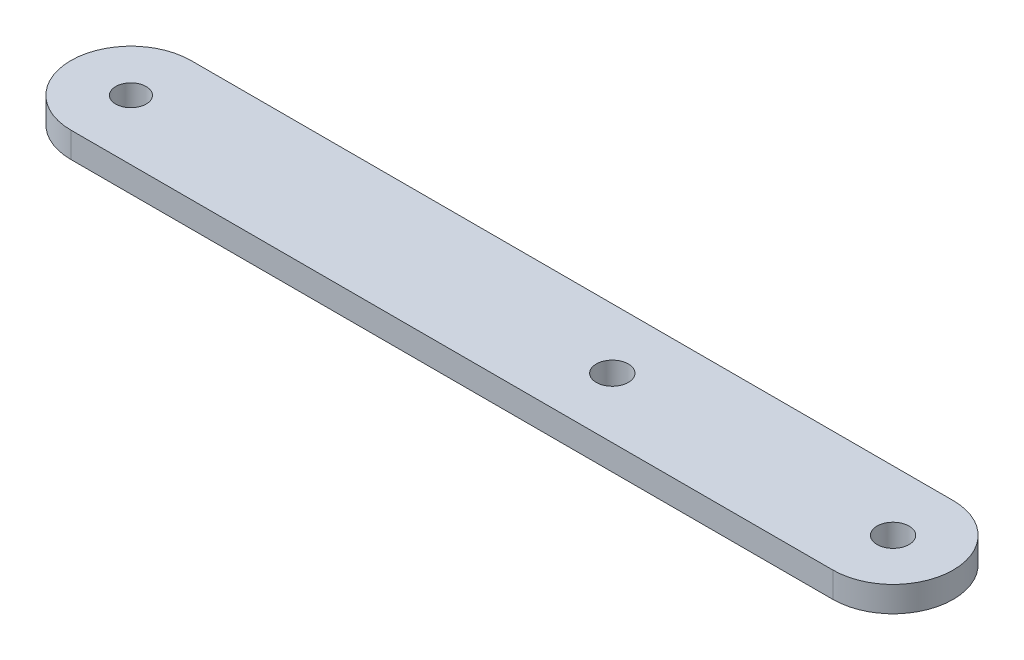
ISO-10303-21;
HEADER;
FILE_DESCRIPTION(('STEP AP214'),'2;1');
FILE_NAME('part.step','',(''),(''),'','','');
FILE_SCHEMA(('AUTOMOTIVE_DESIGN { 1 0 10303 214 1 1 1 1 }'));
ENDSEC;
DATA;
#1=APPLICATION_CONTEXT('core data for automotive mechanical design processes');
#2=APPLICATION_PROTOCOL_DEFINITION('international standard','automotive_design',2000,#1);
#3=PRODUCT_CONTEXT('',#1,'mechanical');
#4=PRODUCT('Part','Part','',(#3));
#5=PRODUCT_RELATED_PRODUCT_CATEGORY('part','',(#4));
#6=PRODUCT_DEFINITION_FORMATION('','',#4);
#7=PRODUCT_DEFINITION_CONTEXT('part definition',#1,'design');
#8=PRODUCT_DEFINITION('design','',#6,#7);
#9=PRODUCT_DEFINITION_SHAPE('','',#8);
#10=(LENGTH_UNIT() NAMED_UNIT(*) SI_UNIT(.MILLI.,.METRE.));
#11=(NAMED_UNIT(*) PLANE_ANGLE_UNIT() SI_UNIT($,.RADIAN.));
#12=(NAMED_UNIT(*) SI_UNIT($,.STERADIAN.) SOLID_ANGLE_UNIT());
#13=UNCERTAINTY_MEASURE_WITH_UNIT(LENGTH_MEASURE(1.E-05),#10,'distance_accuracy_value','');
#14=(GEOMETRIC_REPRESENTATION_CONTEXT(3) GLOBAL_UNCERTAINTY_ASSIGNED_CONTEXT((#13)) GLOBAL_UNIT_ASSIGNED_CONTEXT((#10,
#11,#12)) REPRESENTATION_CONTEXT('',''));
#15=CARTESIAN_POINT('',(0.,0.,0.));
#16=DIRECTION('',(0.,0.,1.));
#17=DIRECTION('',(1.,0.,0.));
#18=AXIS2_PLACEMENT_3D('',#15,#16,#17);
#19=CARTESIAN_POINT('',(0.,3.175,0.));
#20=DIRECTION('',(0.,1.,0.));
#21=DIRECTION('',(0.,0.,1.));
#22=AXIS2_PLACEMENT_3D('',#19,#20,#21);
#23=PLANE('',#22);
#24=CARTESIAN_POINT('',(60.,3.175,0.));
#25=DIRECTION('',(0.,1.,0.));
#26=DIRECTION('',(0.,0.,1.));
#27=AXIS2_PLACEMENT_3D('',#24,#25,#26);
#28=CIRCLE('',#27,2.);
#29=CARTESIAN_POINT('',(60.,3.175,2.));
#30=VERTEX_POINT('',#29);
#31=EDGE_CURVE('E115',#30,#30,#28,.T.);
#32=ORIENTED_EDGE('',*,*,#31,.F.);
#33=EDGE_LOOP('',(#32));
#34=FACE_BOUND('',#33,.T.);
#35=CARTESIAN_POINT('',(0.,3.175,0.));
#36=DIRECTION('',(0.,1.,0.));
#37=DIRECTION('',(0.,0.,1.));
#38=AXIS2_PLACEMENT_3D('',#35,#36,#37);
#39=CIRCLE('',#38,7.5);
#40=CARTESIAN_POINT('',(0.,3.175,-7.5));
#41=VERTEX_POINT('',#40);
#42=CARTESIAN_POINT('',(0.,3.175,7.5));
#43=VERTEX_POINT('',#42);
#44=EDGE_CURVE('E85',#41,#43,#39,.T.);
#45=ORIENTED_EDGE('',*,*,#44,.T.);
#46=DIRECTION('',(1.,0.,0.));
#47=VECTOR('',#46,1.);
#48=CARTESIAN_POINT('',(0.,3.175,7.5));
#49=LINE('',#48,#47);
#50=CARTESIAN_POINT('',(95.,3.175,7.5));
#51=VERTEX_POINT('',#50);
#52=EDGE_CURVE('E80',#43,#51,#49,.T.);
#53=ORIENTED_EDGE('',*,*,#52,.T.);
#54=CARTESIAN_POINT('',(95.,3.175,0.));
#55=DIRECTION('',(0.,1.,0.));
#56=DIRECTION('',(0.,0.,1.));
#57=AXIS2_PLACEMENT_3D('',#54,#55,#56);
#58=CIRCLE('',#57,7.5);
#59=CARTESIAN_POINT('',(95.,3.175,-7.5));
#60=VERTEX_POINT('',#59);
#61=EDGE_CURVE('E83',#51,#60,#58,.T.);
#62=ORIENTED_EDGE('',*,*,#61,.T.);
#63=DIRECTION('',(-1.,0.,0.));
#64=VECTOR('',#63,1.);
#65=CARTESIAN_POINT('',(0.,3.175,-7.5));
#66=LINE('',#65,#64);
#67=EDGE_CURVE('E50',#60,#41,#66,.T.);
#68=ORIENTED_EDGE('',*,*,#67,.T.);
#69=EDGE_LOOP('',(#45,#53,#62,#68));
#70=FACE_BOUND('',#69,.T.);
#71=CARTESIAN_POINT('',(0.,3.175,0.));
#72=DIRECTION('',(0.,1.,0.));
#73=DIRECTION('',(0.,0.,1.));
#74=AXIS2_PLACEMENT_3D('',#71,#72,#73);
#75=CIRCLE('',#74,1.9);
#76=CARTESIAN_POINT('',(0.,3.175,1.9));
#77=VERTEX_POINT('',#76);
#78=EDGE_CURVE('E100',#77,#77,#75,.T.);
#79=ORIENTED_EDGE('',*,*,#78,.F.);
#80=EDGE_LOOP('',(#79));
#81=FACE_BOUND('',#80,.T.);
#82=CARTESIAN_POINT('',(95.,3.175,0.));
#83=DIRECTION('',(0.,1.,0.));
#84=DIRECTION('',(0.,0.,1.));
#85=AXIS2_PLACEMENT_3D('',#82,#83,#84);
#86=CIRCLE('',#85,2.);
#87=CARTESIAN_POINT('',(95.,3.175,2.));
#88=VERTEX_POINT('',#87);
#89=EDGE_CURVE('E121',#88,#88,#86,.T.);
#90=ORIENTED_EDGE('',*,*,#89,.F.);
#91=EDGE_LOOP('',(#90));
#92=FACE_BOUND('',#91,.T.);
#93=ADVANCED_FACE('F33',(#34,#70,#81,#92),#23,.T.);
#94=CARTESIAN_POINT('',(0.,0.,0.));
#95=DIRECTION('',(0.,1.,0.));
#96=DIRECTION('',(0.,0.,1.));
#97=AXIS2_PLACEMENT_3D('',#94,#95,#96);
#98=PLANE('',#97);
#99=CARTESIAN_POINT('',(0.,0.,0.));
#100=DIRECTION('',(0.,1.,0.));
#101=DIRECTION('',(0.,0.,1.));
#102=AXIS2_PLACEMENT_3D('',#99,#100,#101);
#103=CIRCLE('',#102,7.5);
#104=CARTESIAN_POINT('',(0.,0.,-7.5));
#105=VERTEX_POINT('',#104);
#106=CARTESIAN_POINT('',(0.,0.,7.5));
#107=VERTEX_POINT('',#106);
#108=EDGE_CURVE('E97',#105,#107,#103,.T.);
#109=ORIENTED_EDGE('',*,*,#108,.F.);
#110=DIRECTION('',(-1.,0.,0.));
#111=VECTOR('',#110,1.);
#112=CARTESIAN_POINT('',(0.,0.,-7.5));
#113=LINE('',#112,#111);
#114=CARTESIAN_POINT('',(95.,0.,-7.5));
#115=VERTEX_POINT('',#114);
#116=EDGE_CURVE('E73',#115,#105,#113,.T.);
#117=ORIENTED_EDGE('',*,*,#116,.F.);
#118=CARTESIAN_POINT('',(95.,0.,0.));
#119=DIRECTION('',(0.,1.,0.));
#120=DIRECTION('',(0.,0.,1.));
#121=AXIS2_PLACEMENT_3D('',#118,#119,#120);
#122=CIRCLE('',#121,7.5);
#123=CARTESIAN_POINT('',(95.,0.,7.5));
#124=VERTEX_POINT('',#123);
#125=EDGE_CURVE('E67',#124,#115,#122,.T.);
#126=ORIENTED_EDGE('',*,*,#125,.F.);
#127=DIRECTION('',(1.,0.,0.));
#128=VECTOR('',#127,1.);
#129=CARTESIAN_POINT('',(0.,0.,7.5));
#130=LINE('',#129,#128);
#131=EDGE_CURVE('E89',#107,#124,#130,.T.);
#132=ORIENTED_EDGE('',*,*,#131,.F.);
#133=EDGE_LOOP('',(#109,#117,#126,#132));
#134=FACE_BOUND('',#133,.T.);
#135=CARTESIAN_POINT('',(0.,0.,0.));
#136=DIRECTION('',(0.,1.,0.));
#137=DIRECTION('',(0.,0.,1.));
#138=AXIS2_PLACEMENT_3D('',#135,#136,#137);
#139=CIRCLE('',#138,1.9);
#140=CARTESIAN_POINT('',(0.,0.,1.9));
#141=VERTEX_POINT('',#140);
#142=EDGE_CURVE('E112',#141,#141,#139,.T.);
#143=ORIENTED_EDGE('',*,*,#142,.T.);
#144=EDGE_LOOP('',(#143));
#145=FACE_BOUND('',#144,.T.);
#146=CARTESIAN_POINT('',(60.,0.,0.));
#147=DIRECTION('',(0.,1.,0.));
#148=DIRECTION('',(0.,0.,1.));
#149=AXIS2_PLACEMENT_3D('',#146,#147,#148);
#150=CIRCLE('',#149,2.);
#151=CARTESIAN_POINT('',(60.,0.,2.));
#152=VERTEX_POINT('',#151);
#153=EDGE_CURVE('E118',#152,#152,#150,.T.);
#154=ORIENTED_EDGE('',*,*,#153,.T.);
#155=EDGE_LOOP('',(#154));
#156=FACE_BOUND('',#155,.T.);
#157=CARTESIAN_POINT('',(95.,0.,0.));
#158=DIRECTION('',(0.,1.,0.));
#159=DIRECTION('',(0.,0.,1.));
#160=AXIS2_PLACEMENT_3D('',#157,#158,#159);
#161=CIRCLE('',#160,2.);
#162=CARTESIAN_POINT('',(95.,0.,2.));
#163=VERTEX_POINT('',#162);
#164=EDGE_CURVE('E124',#163,#163,#161,.T.);
#165=ORIENTED_EDGE('',*,*,#164,.T.);
#166=EDGE_LOOP('',(#165));
#167=FACE_BOUND('',#166,.T.);
#168=ADVANCED_FACE('F108',(#134,#145,#156,#167),#98,.F.);
#169=CARTESIAN_POINT('',(0.,3.175,0.));
#170=DIRECTION('',(0.,-1.,0.));
#171=DIRECTION('',(0.,0.,-1.));
#172=AXIS2_PLACEMENT_3D('',#169,#170,#171);
#173=CYLINDRICAL_SURFACE('',#172,7.5);
#174=ORIENTED_EDGE('',*,*,#108,.T.);
#175=DIRECTION('',(0.,-1.,0.));
#176=VECTOR('',#175,1.);
#177=CARTESIAN_POINT('',(0.,3.175,7.5));
#178=LINE('',#177,#176);
#179=EDGE_CURVE('E11',#43,#107,#178,.T.);
#180=ORIENTED_EDGE('',*,*,#179,.F.);
#181=ORIENTED_EDGE('',*,*,#44,.F.);
#182=DIRECTION('',(0.,-1.,0.));
#183=VECTOR('',#182,1.);
#184=CARTESIAN_POINT('',(0.,3.175,-7.5));
#185=LINE('',#184,#183);
#186=EDGE_CURVE('E93',#41,#105,#185,.T.);
#187=ORIENTED_EDGE('',*,*,#186,.T.);
#188=EDGE_LOOP('',(#174,#180,#181,#187));
#189=FACE_BOUND('',#188,.T.);
#190=ADVANCED_FACE('F35',(#189),#173,.T.);
#191=CARTESIAN_POINT('',(0.,3.175,7.5));
#192=DIRECTION('',(0.,0.,-1.));
#193=DIRECTION('',(-1.,0.,0.));
#194=AXIS2_PLACEMENT_3D('',#191,#192,#193);
#195=PLANE('',#194);
#196=ORIENTED_EDGE('',*,*,#131,.T.);
#197=DIRECTION('',(0.,-1.,0.));
#198=VECTOR('',#197,1.);
#199=CARTESIAN_POINT('',(95.,3.175,7.5));
#200=LINE('',#199,#198);
#201=EDGE_CURVE('E42',#51,#124,#200,.T.);
#202=ORIENTED_EDGE('',*,*,#201,.F.);
#203=ORIENTED_EDGE('',*,*,#52,.F.);
#204=ORIENTED_EDGE('',*,*,#179,.T.);
#205=EDGE_LOOP('',(#196,#202,#203,#204));
#206=FACE_BOUND('',#205,.T.);
#207=ADVANCED_FACE('F88',(#206),#195,.F.);
#208=CARTESIAN_POINT('',(95.,3.175,0.));
#209=DIRECTION('',(0.,-1.,0.));
#210=DIRECTION('',(0.,0.,-1.));
#211=AXIS2_PLACEMENT_3D('',#208,#209,#210);
#212=CYLINDRICAL_SURFACE('',#211,7.5);
#213=ORIENTED_EDGE('',*,*,#125,.T.);
#214=DIRECTION('',(0.,-1.,0.));
#215=VECTOR('',#214,1.);
#216=CARTESIAN_POINT('',(95.,3.175,-7.5));
#217=LINE('',#216,#215);
#218=EDGE_CURVE('E90',#60,#115,#217,.T.);
#219=ORIENTED_EDGE('',*,*,#218,.F.);
#220=ORIENTED_EDGE('',*,*,#61,.F.);
#221=ORIENTED_EDGE('',*,*,#201,.T.);
#222=EDGE_LOOP('',(#213,#219,#220,#221));
#223=FACE_BOUND('',#222,.T.);
#224=ADVANCED_FACE('F91',(#223),#212,.T.);
#225=CARTESIAN_POINT('',(0.,3.175,-7.5));
#226=DIRECTION('',(0.,0.,1.));
#227=DIRECTION('',(1.,0.,0.));
#228=AXIS2_PLACEMENT_3D('',#225,#226,#227);
#229=PLANE('',#228);
#230=ORIENTED_EDGE('',*,*,#116,.T.);
#231=ORIENTED_EDGE('',*,*,#186,.F.);
#232=ORIENTED_EDGE('',*,*,#67,.F.);
#233=ORIENTED_EDGE('',*,*,#218,.T.);
#234=EDGE_LOOP('',(#230,#231,#232,#233));
#235=FACE_BOUND('',#234,.T.);
#236=ADVANCED_FACE('F105',(#235),#229,.F.);
#237=CARTESIAN_POINT('',(0.,3.175,0.));
#238=DIRECTION('',(0.,-1.,0.));
#239=DIRECTION('',(0.,0.,-1.));
#240=AXIS2_PLACEMENT_3D('',#237,#238,#239);
#241=CYLINDRICAL_SURFACE('',#240,1.9);
#242=ORIENTED_EDGE('',*,*,#78,.T.);
#243=EDGE_LOOP('',(#242));
#244=FACE_BOUND('',#243,.T.);
#245=ORIENTED_EDGE('',*,*,#142,.F.);
#246=EDGE_LOOP('',(#245));
#247=FACE_BOUND('',#246,.T.);
#248=ADVANCED_FACE('F142',(#244,#247),#241,.F.);
#249=CARTESIAN_POINT('',(60.,3.175,0.));
#250=DIRECTION('',(0.,-1.,0.));
#251=DIRECTION('',(0.,0.,-1.));
#252=AXIS2_PLACEMENT_3D('',#249,#250,#251);
#253=CYLINDRICAL_SURFACE('',#252,2.);
#254=ORIENTED_EDGE('',*,*,#31,.T.);
#255=EDGE_LOOP('',(#254));
#256=FACE_BOUND('',#255,.T.);
#257=ORIENTED_EDGE('',*,*,#153,.F.);
#258=EDGE_LOOP('',(#257));
#259=FACE_BOUND('',#258,.T.);
#260=ADVANCED_FACE('F188',(#256,#259),#253,.F.);
#261=CARTESIAN_POINT('',(95.,3.175,0.));
#262=DIRECTION('',(0.,-1.,0.));
#263=DIRECTION('',(0.,0.,-1.));
#264=AXIS2_PLACEMENT_3D('',#261,#262,#263);
#265=CYLINDRICAL_SURFACE('',#264,2.);
#266=ORIENTED_EDGE('',*,*,#89,.T.);
#267=EDGE_LOOP('',(#266));
#268=FACE_BOUND('',#267,.T.);
#269=ORIENTED_EDGE('',*,*,#164,.F.);
#270=EDGE_LOOP('',(#269));
#271=FACE_BOUND('',#270,.T.);
#272=ADVANCED_FACE('F130',(#268,#271),#265,.F.);
#273=CLOSED_SHELL('',(#93,#168,#190,#207,#224,#236,#248,#260,#272));
#274=MANIFOLD_SOLID_BREP('B2',#273);
#275=ADVANCED_BREP_SHAPE_REPRESENTATION('',(#18,#274),#14);
#276=SHAPE_DEFINITION_REPRESENTATION(#9,#275);
ENDSEC;
END-ISO-10303-21;
